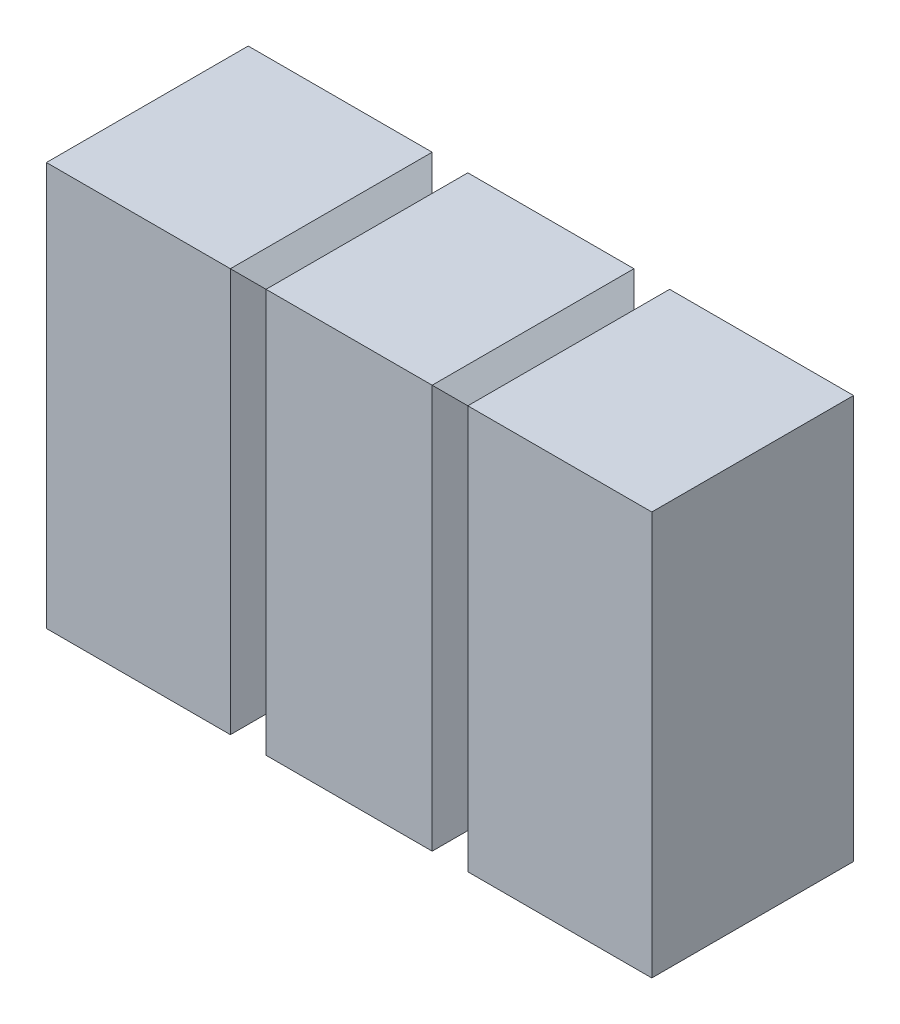
ISO-10303-21;
HEADER;
FILE_DESCRIPTION(('STEP AP214'),'2;1');
FILE_NAME('part.step','',(''),(''),'','','');
FILE_SCHEMA(('AUTOMOTIVE_DESIGN { 1 0 10303 214 1 1 1 1 }'));
ENDSEC;
DATA;
#1=APPLICATION_CONTEXT('core data for automotive mechanical design processes');
#2=APPLICATION_PROTOCOL_DEFINITION('international standard','automotive_design',2000,#1);
#3=PRODUCT_CONTEXT('',#1,'mechanical');
#4=PRODUCT('Part','Part','',(#3));
#5=PRODUCT_RELATED_PRODUCT_CATEGORY('part','',(#4));
#6=PRODUCT_DEFINITION_FORMATION('','',#4);
#7=PRODUCT_DEFINITION_CONTEXT('part definition',#1,'design');
#8=PRODUCT_DEFINITION('design','',#6,#7);
#9=PRODUCT_DEFINITION_SHAPE('','',#8);
#10=(LENGTH_UNIT() NAMED_UNIT(*) SI_UNIT(.MILLI.,.METRE.));
#11=(NAMED_UNIT(*) PLANE_ANGLE_UNIT() SI_UNIT($,.RADIAN.));
#12=(NAMED_UNIT(*) SI_UNIT($,.STERADIAN.) SOLID_ANGLE_UNIT());
#13=UNCERTAINTY_MEASURE_WITH_UNIT(LENGTH_MEASURE(1.E-05),#10,'distance_accuracy_value','');
#14=(GEOMETRIC_REPRESENTATION_CONTEXT(3) GLOBAL_UNCERTAINTY_ASSIGNED_CONTEXT((#13)) GLOBAL_UNIT_ASSIGNED_CONTEXT((#10,
#11,#12)) REPRESENTATION_CONTEXT('',''));
#15=CARTESIAN_POINT('',(0.,0.,0.));
#16=DIRECTION('',(0.,0.,1.));
#17=DIRECTION('',(1.,0.,0.));
#18=AXIS2_PLACEMENT_3D('',#15,#16,#17);
#19=CARTESIAN_POINT('',(6.35,-1.27,0.));
#20=DIRECTION('',(1.,0.,0.));
#21=DIRECTION('',(0.,1.,0.));
#22=AXIS2_PLACEMENT_3D('',#19,#20,#21);
#23=PLANE('',#22);
#24=DIRECTION('',(0.,0.,1.));
#25=VECTOR('',#24,1.);
#26=CARTESIAN_POINT('',(6.35,-1.27,0.));
#27=LINE('',#26,#25);
#28=CARTESIAN_POINT('',(6.35,-1.27,0.));
#29=VERTEX_POINT('',#28);
#30=CARTESIAN_POINT('',(6.35,-1.27,2.54));
#31=VERTEX_POINT('',#30);
#32=EDGE_CURVE('E214',#29,#31,#27,.T.);
#33=ORIENTED_EDGE('',*,*,#32,.F.);
#34=DIRECTION('',(0.,1.,0.));
#35=VECTOR('',#34,1.);
#36=CARTESIAN_POINT('',(6.35,-1.27,0.));
#37=LINE('',#36,#35);
#38=CARTESIAN_POINT('',(6.35,3.81,0.));
#39=VERTEX_POINT('',#38);
#40=EDGE_CURVE('E11',#29,#39,#37,.T.);
#41=ORIENTED_EDGE('',*,*,#40,.T.);
#42=DIRECTION('',(0.,0.,1.));
#43=VECTOR('',#42,1.);
#44=CARTESIAN_POINT('',(6.35,3.81,0.));
#45=LINE('',#44,#43);
#46=CARTESIAN_POINT('',(6.35,3.81,2.54));
#47=VERTEX_POINT('',#46);
#48=EDGE_CURVE('E25',#39,#47,#45,.T.);
#49=ORIENTED_EDGE('',*,*,#48,.T.);
#50=DIRECTION('',(0.,1.,0.));
#51=VECTOR('',#50,1.);
#52=CARTESIAN_POINT('',(6.35,-1.27,2.54));
#53=LINE('',#52,#51);
#54=EDGE_CURVE('E233',#31,#47,#53,.T.);
#55=ORIENTED_EDGE('',*,*,#54,.F.);
#56=EDGE_LOOP('',(#33,#41,#49,#55));
#57=FACE_BOUND('',#56,.T.);
#58=ADVANCED_FACE('F17',(#57),#23,.T.);
#59=CARTESIAN_POINT('',(-1.27,-1.27,0.));
#60=DIRECTION('',(0.,0.,1.));
#61=DIRECTION('',(1.,0.,0.));
#62=AXIS2_PLACEMENT_3D('',#59,#60,#61);
#63=PLANE('',#62);
#64=ORIENTED_EDGE('',*,*,#40,.F.);
#65=DIRECTION('',(1.,0.,0.));
#66=VECTOR('',#65,1.);
#67=CARTESIAN_POINT('',(-1.27,-1.27,0.));
#68=LINE('',#67,#66);
#69=CARTESIAN_POINT('',(4.034506403027,-1.27,0.));
#70=VERTEX_POINT('',#69);
#71=EDGE_CURVE('E213',#70,#29,#68,.T.);
#72=ORIENTED_EDGE('',*,*,#71,.F.);
#73=DIRECTION('',(0.,1.,0.));
#74=VECTOR('',#73,1.);
#75=CARTESIAN_POINT('',(4.034506403027,-1.27,0.));
#76=LINE('',#75,#74);
#77=CARTESIAN_POINT('',(4.034506403027,3.81,0.));
#78=VERTEX_POINT('',#77);
#79=EDGE_CURVE('E252',#70,#78,#76,.T.);
#80=ORIENTED_EDGE('',*,*,#79,.T.);
#81=DIRECTION('',(1.,0.,0.));
#82=VECTOR('',#81,1.);
#83=CARTESIAN_POINT('',(-1.27,3.81,0.));
#84=LINE('',#83,#82);
#85=EDGE_CURVE('E235',#78,#39,#84,.T.);
#86=ORIENTED_EDGE('',*,*,#85,.T.);
#87=EDGE_LOOP('',(#64,#72,#80,#86));
#88=FACE_BOUND('',#87,.T.);
#89=ADVANCED_FACE('F394',(#88),#63,.F.);
#90=CARTESIAN_POINT('',(-1.27,3.81,0.));
#91=DIRECTION('',(0.,1.,0.));
#92=DIRECTION('',(1.,0.,0.));
#93=AXIS2_PLACEMENT_3D('',#90,#91,#92);
#94=PLANE('',#93);
#95=ORIENTED_EDGE('',*,*,#85,.F.);
#96=DIRECTION('',(0.,0.,1.));
#97=VECTOR('',#96,1.);
#98=CARTESIAN_POINT('',(4.034506403027,3.81,0.));
#99=LINE('',#98,#97);
#100=CARTESIAN_POINT('',(4.034506403027,3.81,2.54));
#101=VERTEX_POINT('',#100);
#102=EDGE_CURVE('E253',#78,#101,#99,.T.);
#103=ORIENTED_EDGE('',*,*,#102,.T.);
#104=DIRECTION('',(1.,0.,0.));
#105=VECTOR('',#104,1.);
#106=CARTESIAN_POINT('',(-1.27,3.81,2.54));
#107=LINE('',#106,#105);
#108=EDGE_CURVE('E236',#101,#47,#107,.T.);
#109=ORIENTED_EDGE('',*,*,#108,.T.);
#110=ORIENTED_EDGE('',*,*,#48,.F.);
#111=EDGE_LOOP('',(#95,#103,#109,#110));
#112=FACE_BOUND('',#111,.T.);
#113=ADVANCED_FACE('F397',(#112),#94,.T.);
#114=CARTESIAN_POINT('',(-1.27,-1.27,2.54));
#115=DIRECTION('',(0.,0.,1.));
#116=DIRECTION('',(1.,0.,0.));
#117=AXIS2_PLACEMENT_3D('',#114,#115,#116);
#118=PLANE('',#117);
#119=ORIENTED_EDGE('',*,*,#108,.F.);
#120=DIRECTION('',(0.,1.,0.));
#121=VECTOR('',#120,1.);
#122=CARTESIAN_POINT('',(4.034506403027,-1.27,2.54));
#123=LINE('',#122,#121);
#124=CARTESIAN_POINT('',(4.034506403027,-1.27,2.54));
#125=VERTEX_POINT('',#124);
#126=EDGE_CURVE('E371',#125,#101,#123,.T.);
#127=ORIENTED_EDGE('',*,*,#126,.F.);
#128=DIRECTION('',(1.,0.,0.));
#129=VECTOR('',#128,1.);
#130=CARTESIAN_POINT('',(-1.27,-1.27,2.54));
#131=LINE('',#130,#129);
#132=EDGE_CURVE('E209',#125,#31,#131,.T.);
#133=ORIENTED_EDGE('',*,*,#132,.T.);
#134=ORIENTED_EDGE('',*,*,#54,.T.);
#135=EDGE_LOOP('',(#119,#127,#133,#134));
#136=FACE_BOUND('',#135,.T.);
#137=ADVANCED_FACE('F401',(#136),#118,.T.);
#138=CARTESIAN_POINT('',(-1.27,-1.27,0.));
#139=DIRECTION('',(0.,1.,0.));
#140=DIRECTION('',(1.,0.,0.));
#141=AXIS2_PLACEMENT_3D('',#138,#139,#140);
#142=PLANE('',#141);
#143=ORIENTED_EDGE('',*,*,#32,.T.);
#144=ORIENTED_EDGE('',*,*,#132,.F.);
#145=DIRECTION('',(0.,0.,1.));
#146=VECTOR('',#145,1.);
#147=CARTESIAN_POINT('',(4.034506403027,-1.27,0.));
#148=LINE('',#147,#146);
#149=EDGE_CURVE('E264',#70,#125,#148,.T.);
#150=ORIENTED_EDGE('',*,*,#149,.F.);
#151=ORIENTED_EDGE('',*,*,#71,.T.);
#152=EDGE_LOOP('',(#143,#144,#150,#151));
#153=FACE_BOUND('',#152,.T.);
#154=ADVANCED_FACE('F403',(#153),#142,.F.);
#155=CARTESIAN_POINT('',(3.81,-1.27,0.224506403027));
#156=DIRECTION('',(0.707106781186548,0.,0.707106781186548));
#157=DIRECTION('',(0.,-1.,0.));
#158=AXIS2_PLACEMENT_3D('',#155,#156,#157);
#159=PLANE('',#158);
#160=DIRECTION('',(0.577350269189626,0.577350269189626,-0.577350269189626));
#161=VECTOR('',#160,1.);
#162=CARTESIAN_POINT('',(3.038168801009,2.813662397982,0.996337602018));
#163=LINE('',#162,#161);
#164=CARTESIAN_POINT('',(3.81,3.585493596973,0.224506403027));
#165=VERTEX_POINT('',#164);
#166=EDGE_CURVE('E248',#165,#78,#163,.T.);
#167=ORIENTED_EDGE('',*,*,#166,.T.);
#168=ORIENTED_EDGE('',*,*,#79,.F.);
#169=DIRECTION('',(0.577350269189626,-0.577350269189626,-0.577350269189626));
#170=VECTOR('',#169,1.);
#171=CARTESIAN_POINT('',(3.959670935351,-1.195164532324,0.07483546767558));
#172=LINE('',#171,#170);
#173=CARTESIAN_POINT('',(3.81,-1.045493596973,0.224506403027));
#174=VERTEX_POINT('',#173);
#175=EDGE_CURVE('E269',#174,#70,#172,.T.);
#176=ORIENTED_EDGE('',*,*,#175,.F.);
#177=DIRECTION('',(0.,1.,0.));
#178=VECTOR('',#177,1.);
#179=CARTESIAN_POINT('',(3.81,-1.27,0.224506403027));
#180=LINE('',#179,#178);
#181=EDGE_CURVE('E363',#174,#165,#180,.T.);
#182=ORIENTED_EDGE('',*,*,#181,.T.);
#183=EDGE_LOOP('',(#167,#168,#176,#182));
#184=FACE_BOUND('',#183,.T.);
#185=ADVANCED_FACE('F406',(#184),#159,.F.);
#186=CARTESIAN_POINT('',(3.81,3.585493596973,0.));
#187=DIRECTION('',(-0.707106781186548,0.707106781186548,0.));
#188=DIRECTION('',(0.,0.,1.));
#189=AXIS2_PLACEMENT_3D('',#186,#187,#188);
#190=PLANE('',#189);
#191=ORIENTED_EDGE('',*,*,#102,.F.);
#192=ORIENTED_EDGE('',*,*,#166,.F.);
#193=DIRECTION('',(0.,0.,1.));
#194=VECTOR('',#193,1.);
#195=CARTESIAN_POINT('',(3.81,3.585493596973,0.));
#196=LINE('',#195,#194);
#197=CARTESIAN_POINT('',(3.81,3.585493596973,2.315493596973));
#198=VERTEX_POINT('',#197);
#199=EDGE_CURVE('E359',#165,#198,#196,.T.);
#200=ORIENTED_EDGE('',*,*,#199,.T.);
#201=DIRECTION('',(-0.577350269189626,-0.577350269189626,-0.577350269189626));
#202=VECTOR('',#201,1.);
#203=CARTESIAN_POINT('',(2.614835467676,2.390329064649,1.120329064649));
#204=LINE('',#203,#202);
#205=EDGE_CURVE('E268',#101,#198,#204,.T.);
#206=ORIENTED_EDGE('',*,*,#205,.F.);
#207=EDGE_LOOP('',(#191,#192,#200,#206));
#208=FACE_BOUND('',#207,.T.);
#209=ADVANCED_FACE('F412',(#208),#190,.T.);
#210=CARTESIAN_POINT('',(3.81,-1.27,2.315493596973));
#211=DIRECTION('',(0.707106781186548,0.,-0.707106781186548));
#212=DIRECTION('',(0.,-1.,0.));
#213=AXIS2_PLACEMENT_3D('',#210,#211,#212);
#214=PLANE('',#213);
#215=ORIENTED_EDGE('',*,*,#205,.T.);
#216=DIRECTION('',(0.,1.,0.));
#217=VECTOR('',#216,1.);
#218=CARTESIAN_POINT('',(3.81,-1.27,2.315493596973));
#219=LINE('',#218,#217);
#220=CARTESIAN_POINT('',(3.81,-1.045493596973,2.315493596973));
#221=VERTEX_POINT('',#220);
#222=EDGE_CURVE('E351',#221,#198,#219,.T.);
#223=ORIENTED_EDGE('',*,*,#222,.F.);
#224=DIRECTION('',(-0.577350269189626,0.577350269189626,-0.577350269189626));
#225=VECTOR('',#224,1.);
#226=CARTESIAN_POINT('',(3.536337602018,-0.771831198991,2.041831198991));
#227=LINE('',#226,#225);
#228=EDGE_CURVE('E324',#125,#221,#227,.T.);
#229=ORIENTED_EDGE('',*,*,#228,.F.);
#230=ORIENTED_EDGE('',*,*,#126,.T.);
#231=EDGE_LOOP('',(#215,#223,#229,#230));
#232=FACE_BOUND('',#231,.T.);
#233=ADVANCED_FACE('F416',(#232),#214,.F.);
#234=CARTESIAN_POINT('',(4.034506403027,-1.27,0.));
#235=DIRECTION('',(0.707106781186548,0.707106781186548,0.));
#236=DIRECTION('',(0.,0.,-1.));
#237=AXIS2_PLACEMENT_3D('',#234,#235,#236);
#238=PLANE('',#237);
#239=ORIENTED_EDGE('',*,*,#228,.T.);
#240=DIRECTION('',(0.,0.,1.));
#241=VECTOR('',#240,1.);
#242=CARTESIAN_POINT('',(3.81,-1.045493596973,0.));
#243=LINE('',#242,#241);
#244=EDGE_CURVE('E218',#174,#221,#243,.T.);
#245=ORIENTED_EDGE('',*,*,#244,.F.);
#246=ORIENTED_EDGE('',*,*,#175,.T.);
#247=ORIENTED_EDGE('',*,*,#149,.T.);
#248=EDGE_LOOP('',(#239,#245,#246,#247));
#249=FACE_BOUND('',#248,.T.);
#250=ADVANCED_FACE('F420',(#249),#238,.F.);
#251=CARTESIAN_POINT('',(3.585493596973,-1.27,0.));
#252=DIRECTION('',(0.707106781186548,0.,-0.707106781186548));
#253=DIRECTION('',(0.,-1.,0.));
#254=AXIS2_PLACEMENT_3D('',#251,#252,#253);
#255=PLANE('',#254);
#256=DIRECTION('',(-0.577350269189626,-0.577350269189626,-0.577350269189626));
#257=VECTOR('',#256,1.);
#258=CARTESIAN_POINT('',(3.585493596973,-1.27,0.));
#259=LINE('',#258,#257);
#260=CARTESIAN_POINT('',(3.585493596973,-1.27,0.));
#261=VERTEX_POINT('',#260);
#262=EDGE_CURVE('E348',#174,#261,#259,.T.);
#263=ORIENTED_EDGE('',*,*,#262,.T.);
#264=DIRECTION('',(0.,1.,0.));
#265=VECTOR('',#264,1.);
#266=CARTESIAN_POINT('',(3.585493596973,-1.27,0.));
#267=LINE('',#266,#265);
#268=CARTESIAN_POINT('',(3.585493596973,3.81,0.));
#269=VERTEX_POINT('',#268);
#270=EDGE_CURVE('E215',#261,#269,#267,.T.);
#271=ORIENTED_EDGE('',*,*,#270,.T.);
#272=DIRECTION('',(-0.577350269189626,0.577350269189626,-0.577350269189626));
#273=VECTOR('',#272,1.);
#274=CARTESIAN_POINT('',(4.506995731316,2.888497865658,0.921502134342));
#275=LINE('',#274,#273);
#276=EDGE_CURVE('E360',#165,#269,#275,.T.);
#277=ORIENTED_EDGE('',*,*,#276,.F.);
#278=ORIENTED_EDGE('',*,*,#181,.F.);
#279=EDGE_LOOP('',(#263,#271,#277,#278));
#280=FACE_BOUND('',#279,.T.);
#281=ADVANCED_FACE('F428',(#280),#255,.T.);
#282=CARTESIAN_POINT('',(3.81,3.585493596973,0.));
#283=DIRECTION('',(0.707106781186548,0.707106781186548,0.));
#284=DIRECTION('',(0.,0.,-1.));
#285=AXIS2_PLACEMENT_3D('',#282,#283,#284);
#286=PLANE('',#285);
#287=ORIENTED_EDGE('',*,*,#199,.F.);
#288=ORIENTED_EDGE('',*,*,#276,.T.);
#289=DIRECTION('',(0.,0.,1.));
#290=VECTOR('',#289,1.);
#291=CARTESIAN_POINT('',(3.585493596973,3.81,0.));
#292=LINE('',#291,#290);
#293=CARTESIAN_POINT('',(3.585493596973,3.81,2.54));
#294=VERTEX_POINT('',#293);
#295=EDGE_CURVE('E219',#269,#294,#292,.T.);
#296=ORIENTED_EDGE('',*,*,#295,.T.);
#297=DIRECTION('',(0.577350269189626,-0.577350269189626,-0.577350269189626));
#298=VECTOR('',#297,1.);
#299=CARTESIAN_POINT('',(4.930329064649,2.465164532324,1.195164532324));
#300=LINE('',#299,#298);
#301=EDGE_CURVE('E355',#294,#198,#300,.T.);
#302=ORIENTED_EDGE('',*,*,#301,.T.);
#303=EDGE_LOOP('',(#287,#288,#296,#302));
#304=FACE_BOUND('',#303,.T.);
#305=ADVANCED_FACE('F500',(#304),#286,.T.);
#306=CARTESIAN_POINT('',(3.585493596973,-1.27,2.54));
#307=DIRECTION('',(0.707106781186548,0.,0.707106781186548));
#308=DIRECTION('',(0.,-1.,0.));
#309=AXIS2_PLACEMENT_3D('',#306,#307,#308);
#310=PLANE('',#309);
#311=DIRECTION('',(0.,1.,0.));
#312=VECTOR('',#311,1.);
#313=CARTESIAN_POINT('',(3.585493596973,-1.27,2.54));
#314=LINE('',#313,#312);
#315=CARTESIAN_POINT('',(3.585493596973,-1.27,2.54));
#316=VERTEX_POINT('',#315);
#317=EDGE_CURVE('E240',#316,#294,#314,.T.);
#318=ORIENTED_EDGE('',*,*,#317,.F.);
#319=DIRECTION('',(0.577350269189626,0.577350269189626,-0.577350269189626));
#320=VECTOR('',#319,1.);
#321=CARTESIAN_POINT('',(4.008826930307,-0.846666666667,2.116666666667));
#322=LINE('',#321,#320);
#323=EDGE_CURVE('E344',#316,#221,#322,.T.);
#324=ORIENTED_EDGE('',*,*,#323,.T.);
#325=ORIENTED_EDGE('',*,*,#222,.T.);
#326=ORIENTED_EDGE('',*,*,#301,.F.);
#327=EDGE_LOOP('',(#318,#324,#325,#326));
#328=FACE_BOUND('',#327,.T.);
#329=ADVANCED_FACE('F503',(#328),#310,.T.);
#330=CARTESIAN_POINT('',(3.585493596973,-1.27,0.));
#331=DIRECTION('',(-0.707106781186548,0.707106781186548,0.));
#332=DIRECTION('',(0.,0.,1.));
#333=AXIS2_PLACEMENT_3D('',#330,#331,#332);
#334=PLANE('',#333);
#335=ORIENTED_EDGE('',*,*,#244,.T.);
#336=ORIENTED_EDGE('',*,*,#323,.F.);
#337=DIRECTION('',(0.,0.,1.));
#338=VECTOR('',#337,1.);
#339=CARTESIAN_POINT('',(3.585493596973,-1.27,0.));
#340=LINE('',#339,#338);
#341=EDGE_CURVE('E320',#261,#316,#340,.T.);
#342=ORIENTED_EDGE('',*,*,#341,.F.);
#343=ORIENTED_EDGE('',*,*,#262,.F.);
#344=EDGE_LOOP('',(#335,#336,#342,#343));
#345=FACE_BOUND('',#344,.T.);
#346=ADVANCED_FACE('F423',(#345),#334,.F.);
#347=CARTESIAN_POINT('',(-1.27,-1.27,0.));
#348=DIRECTION('',(0.,0.,1.));
#349=DIRECTION('',(1.,0.,0.));
#350=AXIS2_PLACEMENT_3D('',#347,#348,#349);
#351=PLANE('',#350);
#352=ORIENTED_EDGE('',*,*,#270,.F.);
#353=DIRECTION('',(1.,0.,0.));
#354=VECTOR('',#353,1.);
#355=CARTESIAN_POINT('',(-1.27,-1.27,0.));
#356=LINE('',#355,#354);
#357=CARTESIAN_POINT('',(1.494506403027,-1.27,0.));
#358=VERTEX_POINT('',#357);
#359=EDGE_CURVE('E328',#358,#261,#356,.T.);
#360=ORIENTED_EDGE('',*,*,#359,.F.);
#361=DIRECTION('',(0.,1.,0.));
#362=VECTOR('',#361,1.);
#363=CARTESIAN_POINT('',(1.494506403027,-1.27,0.));
#364=LINE('',#363,#362);
#365=CARTESIAN_POINT('',(1.494506403027,3.81,0.));
#366=VERTEX_POINT('',#365);
#367=EDGE_CURVE('E316',#358,#366,#364,.T.);
#368=ORIENTED_EDGE('',*,*,#367,.T.);
#369=DIRECTION('',(1.,0.,0.));
#370=VECTOR('',#369,1.);
#371=CARTESIAN_POINT('',(-1.27,3.81,0.));
#372=LINE('',#371,#370);
#373=EDGE_CURVE('E244',#366,#269,#372,.T.);
#374=ORIENTED_EDGE('',*,*,#373,.T.);
#375=EDGE_LOOP('',(#352,#360,#368,#374));
#376=FACE_BOUND('',#375,.T.);
#377=ADVANCED_FACE('F431',(#376),#351,.F.);
#378=CARTESIAN_POINT('',(-1.27,3.81,0.));
#379=DIRECTION('',(0.,1.,0.));
#380=DIRECTION('',(1.,0.,0.));
#381=AXIS2_PLACEMENT_3D('',#378,#379,#380);
#382=PLANE('',#381);
#383=ORIENTED_EDGE('',*,*,#373,.F.);
#384=DIRECTION('',(0.,0.,1.));
#385=VECTOR('',#384,1.);
#386=CARTESIAN_POINT('',(1.494506403027,3.81,0.));
#387=LINE('',#386,#385);
#388=CARTESIAN_POINT('',(1.494506403027,3.81,2.54));
#389=VERTEX_POINT('',#388);
#390=EDGE_CURVE('E254',#366,#389,#387,.T.);
#391=ORIENTED_EDGE('',*,*,#390,.T.);
#392=DIRECTION('',(1.,0.,0.));
#393=VECTOR('',#392,1.);
#394=CARTESIAN_POINT('',(-1.27,3.81,2.54));
#395=LINE('',#394,#393);
#396=EDGE_CURVE('E245',#389,#294,#395,.T.);
#397=ORIENTED_EDGE('',*,*,#396,.T.);
#398=ORIENTED_EDGE('',*,*,#295,.F.);
#399=EDGE_LOOP('',(#383,#391,#397,#398));
#400=FACE_BOUND('',#399,.T.);
#401=ADVANCED_FACE('F512',(#400),#382,.T.);
#402=CARTESIAN_POINT('',(-1.27,-1.27,2.54));
#403=DIRECTION('',(0.,0.,1.));
#404=DIRECTION('',(1.,0.,0.));
#405=AXIS2_PLACEMENT_3D('',#402,#403,#404);
#406=PLANE('',#405);
#407=ORIENTED_EDGE('',*,*,#396,.F.);
#408=DIRECTION('',(0.,1.,0.));
#409=VECTOR('',#408,1.);
#410=CARTESIAN_POINT('',(1.494506403027,-1.27,2.54));
#411=LINE('',#410,#409);
#412=CARTESIAN_POINT('',(1.494506403027,-1.27,2.54));
#413=VERTEX_POINT('',#412);
#414=EDGE_CURVE('E259',#413,#389,#411,.T.);
#415=ORIENTED_EDGE('',*,*,#414,.F.);
#416=DIRECTION('',(1.,0.,0.));
#417=VECTOR('',#416,1.);
#418=CARTESIAN_POINT('',(-1.27,-1.27,2.54));
#419=LINE('',#418,#417);
#420=EDGE_CURVE('E201',#413,#316,#419,.T.);
#421=ORIENTED_EDGE('',*,*,#420,.T.);
#422=ORIENTED_EDGE('',*,*,#317,.T.);
#423=EDGE_LOOP('',(#407,#415,#421,#422));
#424=FACE_BOUND('',#423,.T.);
#425=ADVANCED_FACE('F515',(#424),#406,.T.);
#426=CARTESIAN_POINT('',(-1.27,-1.27,0.));
#427=DIRECTION('',(0.,1.,0.));
#428=DIRECTION('',(1.,0.,0.));
#429=AXIS2_PLACEMENT_3D('',#426,#427,#428);
#430=PLANE('',#429);
#431=ORIENTED_EDGE('',*,*,#341,.T.);
#432=ORIENTED_EDGE('',*,*,#420,.F.);
#433=DIRECTION('',(0.,0.,1.));
#434=VECTOR('',#433,1.);
#435=CARTESIAN_POINT('',(1.494506403027,-1.27,0.));
#436=LINE('',#435,#434);
#437=EDGE_CURVE('E282',#358,#413,#436,.T.);
#438=ORIENTED_EDGE('',*,*,#437,.F.);
#439=ORIENTED_EDGE('',*,*,#359,.T.);
#440=EDGE_LOOP('',(#431,#432,#438,#439));
#441=FACE_BOUND('',#440,.T.);
#442=ADVANCED_FACE('F435',(#441),#430,.F.);
#443=CARTESIAN_POINT('',(1.27,-1.27,0.224506403027));
#444=DIRECTION('',(0.707106781186548,0.,0.707106781186548));
#445=DIRECTION('',(0.,-1.,0.));
#446=AXIS2_PLACEMENT_3D('',#443,#444,#445);
#447=PLANE('',#446);
#448=DIRECTION('',(0.577350269189626,0.577350269189626,-0.577350269189626));
#449=VECTOR('',#448,1.);
#450=CARTESIAN_POINT('',(0.498168801009,2.813662397982,0.996337602018));
#451=LINE('',#450,#449);
#452=CARTESIAN_POINT('',(1.27,3.585493596973,0.224506403027));
#453=VERTEX_POINT('',#452);
#454=EDGE_CURVE('E258',#453,#366,#451,.T.);
#455=ORIENTED_EDGE('',*,*,#454,.T.);
#456=ORIENTED_EDGE('',*,*,#367,.F.);
#457=DIRECTION('',(0.577350269189626,-0.577350269189626,-0.577350269189626));
#458=VECTOR('',#457,1.);
#459=CARTESIAN_POINT('',(1.419670935351,-1.195164532324,0.07483546767558));
#460=LINE('',#459,#458);
#461=CARTESIAN_POINT('',(1.27,-1.045493596973,0.224506403027));
#462=VERTEX_POINT('',#461);
#463=EDGE_CURVE('E278',#462,#358,#460,.T.);
#464=ORIENTED_EDGE('',*,*,#463,.F.);
#465=DIRECTION('',(0.,1.,0.));
#466=VECTOR('',#465,1.);
#467=CARTESIAN_POINT('',(1.27,-1.27,0.224506403027));
#468=LINE('',#467,#466);
#469=EDGE_CURVE('E298',#462,#453,#468,.T.);
#470=ORIENTED_EDGE('',*,*,#469,.T.);
#471=EDGE_LOOP('',(#455,#456,#464,#470));
#472=FACE_BOUND('',#471,.T.);
#473=ADVANCED_FACE('F444',(#472),#447,.F.);
#474=CARTESIAN_POINT('',(1.27,3.585493596973,0.));
#475=DIRECTION('',(-0.707106781186548,0.707106781186548,0.));
#476=DIRECTION('',(0.,0.,1.));
#477=AXIS2_PLACEMENT_3D('',#474,#475,#476);
#478=PLANE('',#477);
#479=ORIENTED_EDGE('',*,*,#390,.F.);
#480=ORIENTED_EDGE('',*,*,#454,.F.);
#481=DIRECTION('',(0.,0.,1.));
#482=VECTOR('',#481,1.);
#483=CARTESIAN_POINT('',(1.27,3.585493596973,0.));
#484=LINE('',#483,#482);
#485=CARTESIAN_POINT('',(1.27,3.585493596973,2.315493596973));
#486=VERTEX_POINT('',#485);
#487=EDGE_CURVE('E291',#453,#486,#484,.T.);
#488=ORIENTED_EDGE('',*,*,#487,.T.);
#489=DIRECTION('',(-0.577350269189626,-0.577350269189626,-0.577350269189626));
#490=VECTOR('',#489,1.);
#491=CARTESIAN_POINT('',(0.07483546767558,2.390329064649,1.120329064649));
#492=LINE('',#491,#490);
#493=EDGE_CURVE('E307',#389,#486,#492,.T.);
#494=ORIENTED_EDGE('',*,*,#493,.F.);
#495=EDGE_LOOP('',(#479,#480,#488,#494));
#496=FACE_BOUND('',#495,.T.);
#497=ADVANCED_FACE('F518',(#496),#478,.T.);
#498=CARTESIAN_POINT('',(1.27,-1.27,2.315493596973));
#499=DIRECTION('',(0.707106781186548,0.,-0.707106781186548));
#500=DIRECTION('',(0.,-1.,0.));
#501=AXIS2_PLACEMENT_3D('',#498,#499,#500);
#502=PLANE('',#501);
#503=ORIENTED_EDGE('',*,*,#493,.T.);
#504=DIRECTION('',(0.,1.,0.));
#505=VECTOR('',#504,1.);
#506=CARTESIAN_POINT('',(1.27,-1.27,2.315493596973));
#507=LINE('',#506,#505);
#508=CARTESIAN_POINT('',(1.27,-1.045493596973,2.315493596973));
#509=VERTEX_POINT('',#508);
#510=EDGE_CURVE('E224',#509,#486,#507,.T.);
#511=ORIENTED_EDGE('',*,*,#510,.F.);
#512=DIRECTION('',(-0.577350269189626,0.577350269189626,-0.577350269189626));
#513=VECTOR('',#512,1.);
#514=CARTESIAN_POINT('',(0.996337602018,-0.771831198991,2.041831198991));
#515=LINE('',#514,#513);
#516=EDGE_CURVE('E283',#413,#509,#515,.T.);
#517=ORIENTED_EDGE('',*,*,#516,.F.);
#518=ORIENTED_EDGE('',*,*,#414,.T.);
#519=EDGE_LOOP('',(#503,#511,#517,#518));
#520=FACE_BOUND('',#519,.T.);
#521=ADVANCED_FACE('F521',(#520),#502,.F.);
#522=CARTESIAN_POINT('',(1.494506403027,-1.27,0.));
#523=DIRECTION('',(0.707106781186548,0.707106781186548,0.));
#524=DIRECTION('',(0.,0.,-1.));
#525=AXIS2_PLACEMENT_3D('',#522,#523,#524);
#526=PLANE('',#525);
#527=ORIENTED_EDGE('',*,*,#516,.T.);
#528=DIRECTION('',(0.,0.,1.));
#529=VECTOR('',#528,1.);
#530=CARTESIAN_POINT('',(1.27,-1.045493596973,0.));
#531=LINE('',#530,#529);
#532=EDGE_CURVE('E232',#462,#509,#531,.T.);
#533=ORIENTED_EDGE('',*,*,#532,.F.);
#534=ORIENTED_EDGE('',*,*,#463,.T.);
#535=ORIENTED_EDGE('',*,*,#437,.T.);
#536=EDGE_LOOP('',(#527,#533,#534,#535));
#537=FACE_BOUND('',#536,.T.);
#538=ADVANCED_FACE('F441',(#537),#526,.F.);
#539=CARTESIAN_POINT('',(1.045493596973,-1.27,0.));
#540=DIRECTION('',(0.707106781186548,0.,-0.707106781186548));
#541=DIRECTION('',(0.,-1.,0.));
#542=AXIS2_PLACEMENT_3D('',#539,#540,#541);
#543=PLANE('',#542);
#544=DIRECTION('',(-0.577350269189626,-0.577350269189626,-0.577350269189626));
#545=VECTOR('',#544,1.);
#546=CARTESIAN_POINT('',(1.045493596973,-1.27,0.));
#547=LINE('',#546,#545);
#548=CARTESIAN_POINT('',(1.045493596973,-1.27,0.));
#549=VERTEX_POINT('',#548);
#550=EDGE_CURVE('E221',#462,#549,#547,.T.);
#551=ORIENTED_EDGE('',*,*,#550,.T.);
#552=DIRECTION('',(0.,1.,0.));
#553=VECTOR('',#552,1.);
#554=CARTESIAN_POINT('',(1.045493596973,-1.27,0.));
#555=LINE('',#554,#553);
#556=CARTESIAN_POINT('',(1.045493596973,3.81,0.));
#557=VERTEX_POINT('',#556);
#558=EDGE_CURVE('E228',#549,#557,#555,.T.);
#559=ORIENTED_EDGE('',*,*,#558,.T.);
#560=DIRECTION('',(-0.577350269189626,0.577350269189626,-0.577350269189626));
#561=VECTOR('',#560,1.);
#562=CARTESIAN_POINT('',(1.966995731316,2.888497865658,0.921502134342));
#563=LINE('',#562,#561);
#564=EDGE_CURVE('E295',#453,#557,#563,.T.);
#565=ORIENTED_EDGE('',*,*,#564,.F.);
#566=ORIENTED_EDGE('',*,*,#469,.F.);
#567=EDGE_LOOP('',(#551,#559,#565,#566));
#568=FACE_BOUND('',#567,.T.);
#569=ADVANCED_FACE('F448',(#568),#543,.T.);
#570=CARTESIAN_POINT('',(1.27,3.585493596973,0.));
#571=DIRECTION('',(0.707106781186548,0.707106781186548,0.));
#572=DIRECTION('',(0.,0.,-1.));
#573=AXIS2_PLACEMENT_3D('',#570,#571,#572);
#574=PLANE('',#573);
#575=ORIENTED_EDGE('',*,*,#487,.F.);
#576=ORIENTED_EDGE('',*,*,#564,.T.);
#577=DIRECTION('',(0.,0.,1.));
#578=VECTOR('',#577,1.);
#579=CARTESIAN_POINT('',(1.045493596973,3.81,0.));
#580=LINE('',#579,#578);
#581=CARTESIAN_POINT('',(1.045493596973,3.81,2.54));
#582=VERTEX_POINT('',#581);
#583=EDGE_CURVE('E206',#557,#582,#580,.T.);
#584=ORIENTED_EDGE('',*,*,#583,.T.);
#585=DIRECTION('',(0.577350269189626,-0.577350269189626,-0.577350269189626));
#586=VECTOR('',#585,1.);
#587=CARTESIAN_POINT('',(2.390329064649,2.465164532324,1.195164532324));
#588=LINE('',#587,#586);
#589=EDGE_CURVE('E287',#582,#486,#588,.T.);
#590=ORIENTED_EDGE('',*,*,#589,.T.);
#591=EDGE_LOOP('',(#575,#576,#584,#590));
#592=FACE_BOUND('',#591,.T.);
#593=ADVANCED_FACE('F525',(#592),#574,.T.);
#594=CARTESIAN_POINT('',(1.045493596973,-1.27,2.54));
#595=DIRECTION('',(0.707106781186548,0.,0.707106781186548));
#596=DIRECTION('',(0.,-1.,0.));
#597=AXIS2_PLACEMENT_3D('',#594,#595,#596);
#598=PLANE('',#597);
#599=DIRECTION('',(0.,1.,0.));
#600=VECTOR('',#599,1.);
#601=CARTESIAN_POINT('',(1.045493596973,-1.27,2.54));
#602=LINE('',#601,#600);
#603=CARTESIAN_POINT('',(1.045493596973,-1.27,2.54));
#604=VERTEX_POINT('',#603);
#605=EDGE_CURVE('E207',#604,#582,#602,.T.);
#606=ORIENTED_EDGE('',*,*,#605,.F.);
#607=DIRECTION('',(0.577350269189626,0.577350269189626,-0.577350269189626));
#608=VECTOR('',#607,1.);
#609=CARTESIAN_POINT('',(1.468826930307,-0.846666666667,2.116666666667));
#610=LINE('',#609,#608);
#611=EDGE_CURVE('E225',#604,#509,#610,.T.);
#612=ORIENTED_EDGE('',*,*,#611,.T.);
#613=ORIENTED_EDGE('',*,*,#510,.T.);
#614=ORIENTED_EDGE('',*,*,#589,.F.);
#615=EDGE_LOOP('',(#606,#612,#613,#614));
#616=FACE_BOUND('',#615,.T.);
#617=ADVANCED_FACE('F457',(#616),#598,.T.);
#618=CARTESIAN_POINT('',(1.045493596973,-1.27,0.));
#619=DIRECTION('',(-0.707106781186548,0.707106781186548,0.));
#620=DIRECTION('',(0.,0.,1.));
#621=AXIS2_PLACEMENT_3D('',#618,#619,#620);
#622=PLANE('',#621);
#623=ORIENTED_EDGE('',*,*,#532,.T.);
#624=ORIENTED_EDGE('',*,*,#611,.F.);
#625=DIRECTION('',(0.,0.,1.));
#626=VECTOR('',#625,1.);
#627=CARTESIAN_POINT('',(1.045493596973,-1.27,0.));
#628=LINE('',#627,#626);
#629=EDGE_CURVE('E171',#549,#604,#628,.T.);
#630=ORIENTED_EDGE('',*,*,#629,.F.);
#631=ORIENTED_EDGE('',*,*,#550,.F.);
#632=EDGE_LOOP('',(#623,#624,#630,#631));
#633=FACE_BOUND('',#632,.T.);
#634=ADVANCED_FACE('F452',(#633),#622,.F.);
#635=CARTESIAN_POINT('',(-1.27,-1.27,0.));
#636=DIRECTION('',(0.,0.,1.));
#637=DIRECTION('',(1.,0.,0.));
#638=AXIS2_PLACEMENT_3D('',#635,#636,#637);
#639=PLANE('',#638);
#640=ORIENTED_EDGE('',*,*,#558,.F.);
#641=DIRECTION('',(1.,0.,0.));
#642=VECTOR('',#641,1.);
#643=CARTESIAN_POINT('',(-1.27,-1.27,0.));
#644=LINE('',#643,#642);
#645=CARTESIAN_POINT('',(-1.27,-1.27,0.));
#646=VERTEX_POINT('',#645);
#647=EDGE_CURVE('E176',#646,#549,#644,.T.);
#648=ORIENTED_EDGE('',*,*,#647,.F.);
#649=DIRECTION('',(0.,1.,0.));
#650=VECTOR('',#649,1.);
#651=CARTESIAN_POINT('',(-1.27,-1.27,0.));
#652=LINE('',#651,#650);
#653=CARTESIAN_POINT('',(-1.27,3.81,0.));
#654=VERTEX_POINT('',#653);
#655=EDGE_CURVE('E184',#646,#654,#652,.T.);
#656=ORIENTED_EDGE('',*,*,#655,.T.);
#657=DIRECTION('',(1.,0.,0.));
#658=VECTOR('',#657,1.);
#659=CARTESIAN_POINT('',(-1.27,3.81,0.));
#660=LINE('',#659,#658);
#661=EDGE_CURVE('E203',#654,#557,#660,.T.);
#662=ORIENTED_EDGE('',*,*,#661,.T.);
#663=EDGE_LOOP('',(#640,#648,#656,#662));
#664=FACE_BOUND('',#663,.T.);
#665=ADVANCED_FACE('F462',(#664),#639,.F.);
#666=CARTESIAN_POINT('',(-1.27,3.81,0.));
#667=DIRECTION('',(0.,1.,0.));
#668=DIRECTION('',(1.,0.,0.));
#669=AXIS2_PLACEMENT_3D('',#666,#667,#668);
#670=PLANE('',#669);
#671=ORIENTED_EDGE('',*,*,#661,.F.);
#672=DIRECTION('',(0.,0.,1.));
#673=VECTOR('',#672,1.);
#674=CARTESIAN_POINT('',(-1.27,3.81,0.));
#675=LINE('',#674,#673);
#676=CARTESIAN_POINT('',(-1.27,3.81,2.54));
#677=VERTEX_POINT('',#676);
#678=EDGE_CURVE('E192',#654,#677,#675,.T.);
#679=ORIENTED_EDGE('',*,*,#678,.T.);
#680=DIRECTION('',(1.,0.,0.));
#681=VECTOR('',#680,1.);
#682=CARTESIAN_POINT('',(-1.27,3.81,2.54));
#683=LINE('',#682,#681);
#684=EDGE_CURVE('E189',#677,#582,#683,.T.);
#685=ORIENTED_EDGE('',*,*,#684,.T.);
#686=ORIENTED_EDGE('',*,*,#583,.F.);
#687=EDGE_LOOP('',(#671,#679,#685,#686));
#688=FACE_BOUND('',#687,.T.);
#689=ADVANCED_FACE('F460',(#688),#670,.T.);
#690=CARTESIAN_POINT('',(-1.27,-1.27,2.54));
#691=DIRECTION('',(0.,0.,1.));
#692=DIRECTION('',(1.,0.,0.));
#693=AXIS2_PLACEMENT_3D('',#690,#691,#692);
#694=PLANE('',#693);
#695=ORIENTED_EDGE('',*,*,#684,.F.);
#696=DIRECTION('',(0.,1.,0.));
#697=VECTOR('',#696,1.);
#698=CARTESIAN_POINT('',(-1.27,-1.27,2.54));
#699=LINE('',#698,#697);
#700=CARTESIAN_POINT('',(-1.27,-1.27,2.54));
#701=VERTEX_POINT('',#700);
#702=EDGE_CURVE('E182',#701,#677,#699,.T.);
#703=ORIENTED_EDGE('',*,*,#702,.F.);
#704=DIRECTION('',(1.,0.,0.));
#705=VECTOR('',#704,1.);
#706=CARTESIAN_POINT('',(-1.27,-1.27,2.54));
#707=LINE('',#706,#705);
#708=EDGE_CURVE('E164',#701,#604,#707,.T.);
#709=ORIENTED_EDGE('',*,*,#708,.T.);
#710=ORIENTED_EDGE('',*,*,#605,.T.);
#711=EDGE_LOOP('',(#695,#703,#709,#710));
#712=FACE_BOUND('',#711,.T.);
#713=ADVANCED_FACE('F187',(#712),#694,.T.);
#714=CARTESIAN_POINT('',(-1.27,-1.27,0.));
#715=DIRECTION('',(0.,1.,0.));
#716=DIRECTION('',(1.,0.,0.));
#717=AXIS2_PLACEMENT_3D('',#714,#715,#716);
#718=PLANE('',#717);
#719=ORIENTED_EDGE('',*,*,#629,.T.);
#720=ORIENTED_EDGE('',*,*,#708,.F.);
#721=DIRECTION('',(0.,0.,1.));
#722=VECTOR('',#721,1.);
#723=CARTESIAN_POINT('',(-1.27,-1.27,0.));
#724=LINE('',#723,#722);
#725=EDGE_CURVE('E168',#646,#701,#724,.T.);
#726=ORIENTED_EDGE('',*,*,#725,.F.);
#727=ORIENTED_EDGE('',*,*,#647,.T.);
#728=EDGE_LOOP('',(#719,#720,#726,#727));
#729=FACE_BOUND('',#728,.T.);
#730=ADVANCED_FACE('F166',(#729),#718,.F.);
#731=CARTESIAN_POINT('',(-1.27,-1.27,0.));
#732=DIRECTION('',(1.,0.,0.));
#733=DIRECTION('',(0.,1.,0.));
#734=AXIS2_PLACEMENT_3D('',#731,#732,#733);
#735=PLANE('',#734);
#736=ORIENTED_EDGE('',*,*,#702,.T.);
#737=ORIENTED_EDGE('',*,*,#678,.F.);
#738=ORIENTED_EDGE('',*,*,#655,.F.);
#739=ORIENTED_EDGE('',*,*,#725,.T.);
#740=EDGE_LOOP('',(#736,#737,#738,#739));
#741=FACE_BOUND('',#740,.T.);
#742=ADVANCED_FACE('F180',(#741),#735,.F.);
#743=CLOSED_SHELL('',(#58,#89,#113,#137,#154,#185,#209,#233,#250,#281,#305,#329,#346,#377,#401,
#425,#442,#473,#497,#521,#538,#569,#593,#617,#634,#665,#689,#713,#730,#742));
#744=MANIFOLD_SOLID_BREP('B1',#743);
#745=ADVANCED_BREP_SHAPE_REPRESENTATION('',(#18,#744),#14);
#746=SHAPE_DEFINITION_REPRESENTATION(#9,#745);
ENDSEC;
END-ISO-10303-21;
